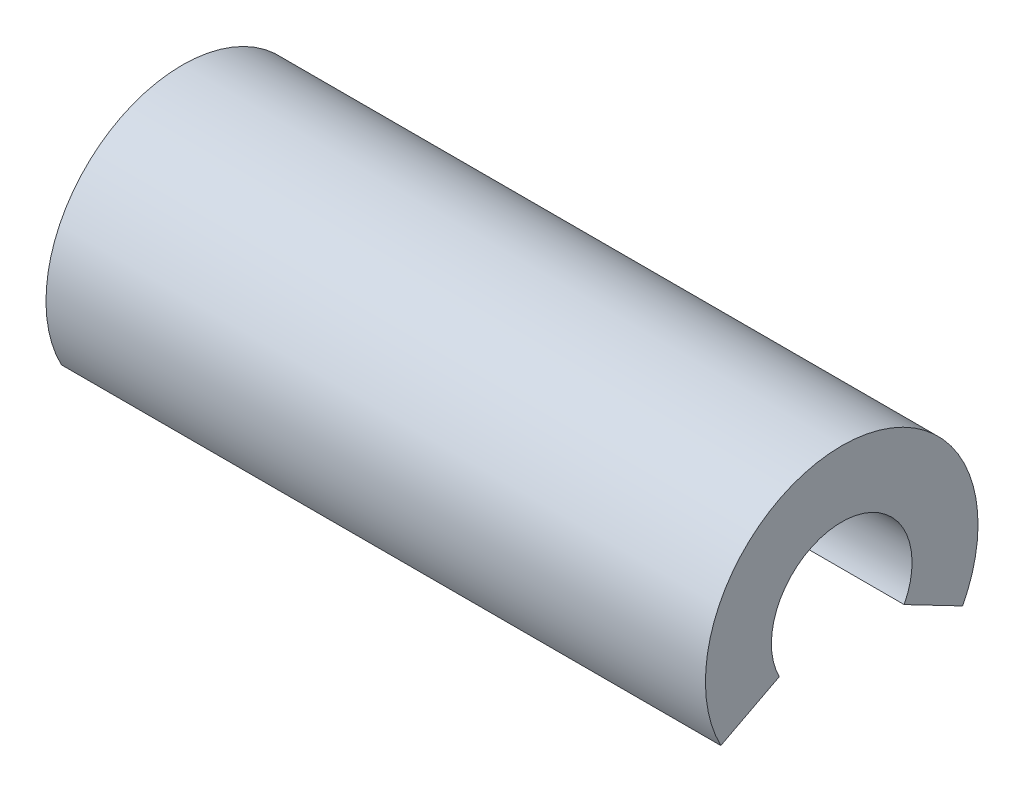
ISO-10303-21;
HEADER;
FILE_DESCRIPTION(('STEP AP214'),'2;1');
FILE_NAME('part.step','',(''),(''),'','','');
FILE_SCHEMA(('AUTOMOTIVE_DESIGN { 1 0 10303 214 1 1 1 1 }'));
ENDSEC;
DATA;
#1=APPLICATION_CONTEXT('core data for automotive mechanical design processes');
#2=APPLICATION_PROTOCOL_DEFINITION('international standard','automotive_design',2000,#1);
#3=PRODUCT_CONTEXT('',#1,'mechanical');
#4=PRODUCT('Part','Part','',(#3));
#5=PRODUCT_RELATED_PRODUCT_CATEGORY('part','',(#4));
#6=PRODUCT_DEFINITION_FORMATION('','',#4);
#7=PRODUCT_DEFINITION_CONTEXT('part definition',#1,'design');
#8=PRODUCT_DEFINITION('design','',#6,#7);
#9=PRODUCT_DEFINITION_SHAPE('','',#8);
#10=(LENGTH_UNIT() NAMED_UNIT(*) SI_UNIT(.MILLI.,.METRE.));
#11=(NAMED_UNIT(*) PLANE_ANGLE_UNIT() SI_UNIT($,.RADIAN.));
#12=(NAMED_UNIT(*) SI_UNIT($,.STERADIAN.) SOLID_ANGLE_UNIT());
#13=UNCERTAINTY_MEASURE_WITH_UNIT(LENGTH_MEASURE(1.E-05),#10,'distance_accuracy_value','');
#14=(GEOMETRIC_REPRESENTATION_CONTEXT(3) GLOBAL_UNCERTAINTY_ASSIGNED_CONTEXT((#13)) GLOBAL_UNIT_ASSIGNED_CONTEXT((#10,
#11,#12)) REPRESENTATION_CONTEXT('',''));
#15=CARTESIAN_POINT('',(0.,0.,0.));
#16=DIRECTION('',(0.,0.,1.));
#17=DIRECTION('',(1.,0.,0.));
#18=AXIS2_PLACEMENT_3D('',#15,#16,#17);
#19=CARTESIAN_POINT('',(30.,0.,0.));
#20=DIRECTION('',(-1.,0.,0.));
#21=DIRECTION('',(0.,0.,1.));
#22=AXIS2_PLACEMENT_3D('',#19,#20,#21);
#23=CYLINDRICAL_SURFACE('',#22,3.2);
#24=CARTESIAN_POINT('',(0.,0.,0.));
#25=DIRECTION('',(-1.,0.,0.));
#26=DIRECTION('',(0.,0.,1.));
#27=AXIS2_PLACEMENT_3D('',#24,#25,#26);
#28=CIRCLE('',#27,3.2);
#29=CARTESIAN_POINT('',(0.,-1.47706715058108,2.83870967741935));
#30=VERTEX_POINT('',#29);
#31=CARTESIAN_POINT('',(0.,-1.47706715058108,-2.83870967741935));
#32=VERTEX_POINT('',#31);
#33=EDGE_CURVE('E96',#30,#32,#28,.T.);
#34=ORIENTED_EDGE('',*,*,#33,.T.);
#35=DIRECTION('',(-1.,0.,0.));
#36=VECTOR('',#35,1.);
#37=CARTESIAN_POINT('',(30.,-1.47706715058108,-2.83870967741935));
#38=LINE('',#37,#36);
#39=CARTESIAN_POINT('',(30.,-1.47706715058108,-2.83870967741935));
#40=VERTEX_POINT('',#39);
#41=EDGE_CURVE('E11',#40,#32,#38,.T.);
#42=ORIENTED_EDGE('',*,*,#41,.F.);
#43=CARTESIAN_POINT('',(30.,0.,0.));
#44=DIRECTION('',(-1.,0.,0.));
#45=DIRECTION('',(0.,0.,1.));
#46=AXIS2_PLACEMENT_3D('',#43,#44,#45);
#47=CIRCLE('',#46,3.2);
#48=CARTESIAN_POINT('',(30.,-1.47706715058108,2.83870967741935));
#49=VERTEX_POINT('',#48);
#50=EDGE_CURVE('E84',#49,#40,#47,.T.);
#51=ORIENTED_EDGE('',*,*,#50,.F.);
#52=DIRECTION('',(-1.,0.,0.));
#53=VECTOR('',#52,1.);
#54=CARTESIAN_POINT('',(30.,-1.47706715058108,2.83870967741935));
#55=LINE('',#54,#53);
#56=EDGE_CURVE('E92',#49,#30,#55,.T.);
#57=ORIENTED_EDGE('',*,*,#56,.T.);
#58=EDGE_LOOP('',(#34,#42,#51,#57));
#59=FACE_BOUND('',#58,.T.);
#60=ADVANCED_FACE('F33',(#59),#23,.F.);
#61=CARTESIAN_POINT('',(30.,-1.47706715058108,-2.83870967741935));
#62=DIRECTION('',(0.,0.887096774193548,-0.461583484556587));
#63=DIRECTION('',(0.,0.461583484556587,0.887096774193548));
#64=AXIS2_PLACEMENT_3D('',#61,#62,#63);
#65=PLANE('',#64);
#66=DIRECTION('',(0.,-0.461583484556587,-0.887096774193548));
#67=VECTOR('',#66,1.);
#68=CARTESIAN_POINT('',(0.,-1.47706715058108,-2.83870967741935));
#69=LINE('',#68,#67);
#70=CARTESIAN_POINT('',(0.,-2.86181760425084,-5.5));
#71=VERTEX_POINT('',#70);
#72=EDGE_CURVE('E88',#32,#71,#69,.T.);
#73=ORIENTED_EDGE('',*,*,#72,.T.);
#74=DIRECTION('',(-1.,0.,0.));
#75=VECTOR('',#74,1.);
#76=CARTESIAN_POINT('',(30.,-2.86181760425084,-5.5));
#77=LINE('',#76,#75);
#78=CARTESIAN_POINT('',(30.,-2.86181760425084,-5.5));
#79=VERTEX_POINT('',#78);
#80=EDGE_CURVE('E41',#79,#71,#77,.T.);
#81=ORIENTED_EDGE('',*,*,#80,.F.);
#82=DIRECTION('',(0.,-0.461583484556587,-0.887096774193548));
#83=VECTOR('',#82,1.);
#84=CARTESIAN_POINT('',(30.,-1.47706715058108,-2.83870967741935));
#85=LINE('',#84,#83);
#86=EDGE_CURVE('E79',#40,#79,#85,.T.);
#87=ORIENTED_EDGE('',*,*,#86,.F.);
#88=ORIENTED_EDGE('',*,*,#41,.T.);
#89=EDGE_LOOP('',(#73,#81,#87,#88));
#90=FACE_BOUND('',#89,.T.);
#91=ADVANCED_FACE('F87',(#90),#65,.F.);
#92=CARTESIAN_POINT('',(30.,0.,0.));
#93=DIRECTION('',(-1.,0.,0.));
#94=DIRECTION('',(0.,0.,1.));
#95=AXIS2_PLACEMENT_3D('',#92,#93,#94);
#96=CYLINDRICAL_SURFACE('',#95,6.2);
#97=CARTESIAN_POINT('',(0.,0.,0.));
#98=DIRECTION('',(1.,0.,0.));
#99=DIRECTION('',(0.,0.,-1.));
#100=AXIS2_PLACEMENT_3D('',#97,#98,#99);
#101=CIRCLE('',#100,6.2);
#102=CARTESIAN_POINT('',(0.,-2.86181760425084,5.5));
#103=VERTEX_POINT('',#102);
#104=EDGE_CURVE('E66',#71,#103,#101,.T.);
#105=ORIENTED_EDGE('',*,*,#104,.T.);
#106=DIRECTION('',(-1.,0.,0.));
#107=VECTOR('',#106,1.);
#108=CARTESIAN_POINT('',(30.,-2.86181760425084,5.5));
#109=LINE('',#108,#107);
#110=CARTESIAN_POINT('',(30.,-2.86181760425084,5.5));
#111=VERTEX_POINT('',#110);
#112=EDGE_CURVE('E89',#111,#103,#109,.T.);
#113=ORIENTED_EDGE('',*,*,#112,.F.);
#114=CARTESIAN_POINT('',(30.,0.,0.));
#115=DIRECTION('',(1.,0.,0.));
#116=DIRECTION('',(0.,0.,-1.));
#117=AXIS2_PLACEMENT_3D('',#114,#115,#116);
#118=CIRCLE('',#117,6.2);
#119=EDGE_CURVE('E82',#79,#111,#118,.T.);
#120=ORIENTED_EDGE('',*,*,#119,.F.);
#121=ORIENTED_EDGE('',*,*,#80,.T.);
#122=EDGE_LOOP('',(#105,#113,#120,#121));
#123=FACE_BOUND('',#122,.T.);
#124=ADVANCED_FACE('F90',(#123),#96,.T.);
#125=CARTESIAN_POINT('',(30.,-2.86181760425084,5.5));
#126=DIRECTION('',(0.,0.887096774193548,0.461583484556587));
#127=DIRECTION('',(0.,-0.461583484556587,0.887096774193548));
#128=AXIS2_PLACEMENT_3D('',#125,#126,#127);
#129=PLANE('',#128);
#130=DIRECTION('',(0.,0.461583484556587,-0.887096774193548));
#131=VECTOR('',#130,1.);
#132=CARTESIAN_POINT('',(0.,-2.86181760425084,5.5));
#133=LINE('',#132,#131);
#134=EDGE_CURVE('E72',#103,#30,#133,.T.);
#135=ORIENTED_EDGE('',*,*,#134,.T.);
#136=ORIENTED_EDGE('',*,*,#56,.F.);
#137=DIRECTION('',(0.,0.461583484556587,-0.887096774193548));
#138=VECTOR('',#137,1.);
#139=CARTESIAN_POINT('',(30.,-2.86181760425084,5.5));
#140=LINE('',#139,#138);
#141=EDGE_CURVE('E49',#111,#49,#140,.T.);
#142=ORIENTED_EDGE('',*,*,#141,.F.);
#143=ORIENTED_EDGE('',*,*,#112,.T.);
#144=EDGE_LOOP('',(#135,#136,#142,#143));
#145=FACE_BOUND('',#144,.T.);
#146=ADVANCED_FACE('F103',(#145),#129,.F.);
#147=CARTESIAN_POINT('',(30.,0.,0.));
#148=DIRECTION('',(-1.,0.,0.));
#149=DIRECTION('',(0.,0.,1.));
#150=AXIS2_PLACEMENT_3D('',#147,#148,#149);
#151=PLANE('',#150);
#152=ORIENTED_EDGE('',*,*,#50,.T.);
#153=ORIENTED_EDGE('',*,*,#86,.T.);
#154=ORIENTED_EDGE('',*,*,#119,.T.);
#155=ORIENTED_EDGE('',*,*,#141,.T.);
#156=EDGE_LOOP('',(#152,#153,#154,#155));
#157=FACE_BOUND('',#156,.T.);
#158=ADVANCED_FACE('F80',(#157),#151,.F.);
#159=CARTESIAN_POINT('',(0.,0.,0.));
#160=DIRECTION('',(-1.,0.,0.));
#161=DIRECTION('',(0.,0.,1.));
#162=AXIS2_PLACEMENT_3D('',#159,#160,#161);
#163=PLANE('',#162);
#164=ORIENTED_EDGE('',*,*,#33,.F.);
#165=ORIENTED_EDGE('',*,*,#134,.F.);
#166=ORIENTED_EDGE('',*,*,#104,.F.);
#167=ORIENTED_EDGE('',*,*,#72,.F.);
#168=EDGE_LOOP('',(#164,#165,#166,#167));
#169=FACE_BOUND('',#168,.T.);
#170=ADVANCED_FACE('F106',(#169),#163,.T.);
#171=CLOSED_SHELL('',(#60,#91,#124,#146,#158,#170));
#172=MANIFOLD_SOLID_BREP('B2',#171);
#173=ADVANCED_BREP_SHAPE_REPRESENTATION('',(#18,#172),#14);
#174=SHAPE_DEFINITION_REPRESENTATION(#9,#173);
ENDSEC;
END-ISO-10303-21;
